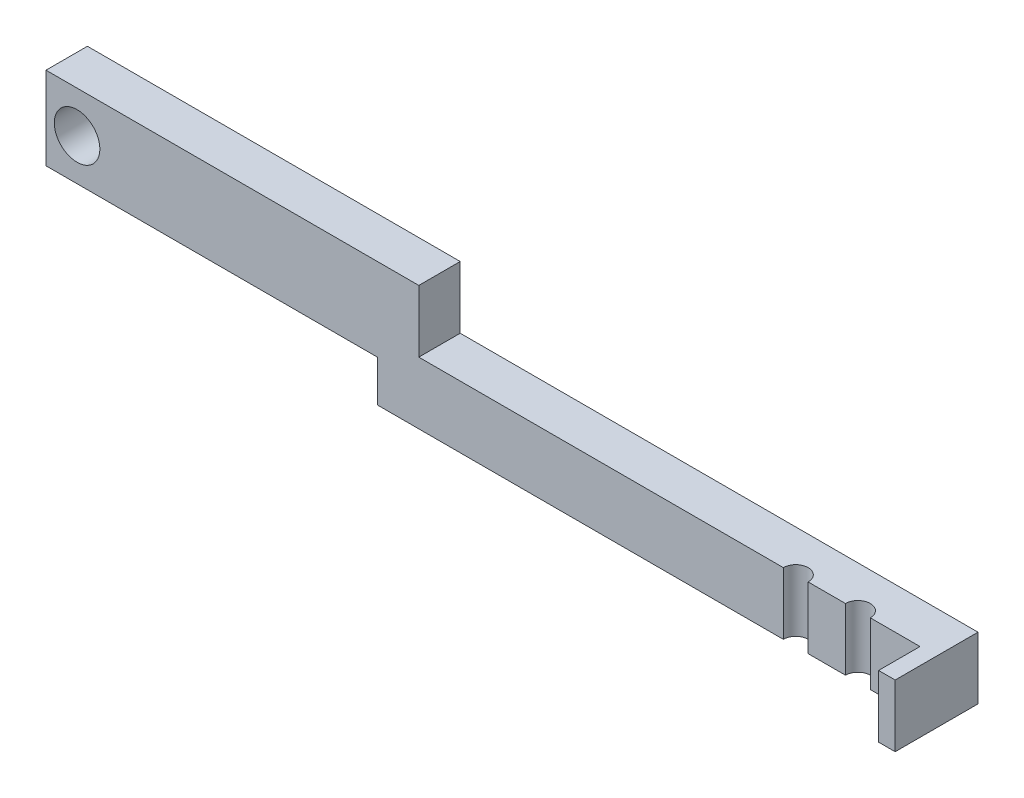
ISO-10303-21;
HEADER;
FILE_DESCRIPTION(('STEP AP214'),'2;1');
FILE_NAME('part.step','',(''),(''),'','','');
FILE_SCHEMA(('AUTOMOTIVE_DESIGN { 1 0 10303 214 1 1 1 1 }'));
ENDSEC;
DATA;
#1=APPLICATION_CONTEXT('core data for automotive mechanical design processes');
#2=APPLICATION_PROTOCOL_DEFINITION('international standard','automotive_design',2000,#1);
#3=PRODUCT_CONTEXT('',#1,'mechanical');
#4=PRODUCT('Part','Part','',(#3));
#5=PRODUCT_RELATED_PRODUCT_CATEGORY('part','',(#4));
#6=PRODUCT_DEFINITION_FORMATION('','',#4);
#7=PRODUCT_DEFINITION_CONTEXT('part definition',#1,'design');
#8=PRODUCT_DEFINITION('design','',#6,#7);
#9=PRODUCT_DEFINITION_SHAPE('','',#8);
#10=(LENGTH_UNIT() NAMED_UNIT(*) SI_UNIT(.MILLI.,.METRE.));
#11=(NAMED_UNIT(*) PLANE_ANGLE_UNIT() SI_UNIT($,.RADIAN.));
#12=(NAMED_UNIT(*) SI_UNIT($,.STERADIAN.) SOLID_ANGLE_UNIT());
#13=UNCERTAINTY_MEASURE_WITH_UNIT(LENGTH_MEASURE(1.E-05),#10,'distance_accuracy_value','');
#14=(GEOMETRIC_REPRESENTATION_CONTEXT(3) GLOBAL_UNCERTAINTY_ASSIGNED_CONTEXT((#13)) GLOBAL_UNIT_ASSIGNED_CONTEXT((#10,
#11,#12)) REPRESENTATION_CONTEXT('',''));
#15=CARTESIAN_POINT('',(0.,0.,0.));
#16=DIRECTION('',(0.,0.,1.));
#17=DIRECTION('',(1.,0.,0.));
#18=AXIS2_PLACEMENT_3D('',#15,#16,#17);
#19=CARTESIAN_POINT('',(0.,0.,2.));
#20=DIRECTION('',(0.,0.,-1.));
#21=DIRECTION('',(-1.,0.,0.));
#22=AXIS2_PLACEMENT_3D('',#19,#20,#21);
#23=PLANE('',#22);
#24=DIRECTION('',(1.,0.,0.));
#25=VECTOR('',#24,1.);
#26=CARTESIAN_POINT('',(16.,-2.,2.));
#27=LINE('',#26,#25);
#28=CARTESIAN_POINT('',(36.8,-2.,2.));
#29=VERTEX_POINT('',#28);
#30=CARTESIAN_POINT('',(38.6,-2.,2.));
#31=VERTEX_POINT('',#30);
#32=EDGE_CURVE('E148',#29,#31,#27,.T.);
#33=ORIENTED_EDGE('',*,*,#32,.T.);
#34=DIRECTION('',(0.,1.,0.));
#35=VECTOR('',#34,1.);
#36=CARTESIAN_POINT('',(38.6,-2.,2.));
#37=LINE('',#36,#35);
#38=CARTESIAN_POINT('',(38.6,1.,2.));
#39=VERTEX_POINT('',#38);
#40=EDGE_CURVE('E183',#31,#39,#37,.T.);
#41=ORIENTED_EDGE('',*,*,#40,.T.);
#42=DIRECTION('',(-1.,0.,0.));
#43=VECTOR('',#42,1.);
#44=CARTESIAN_POINT('',(43.,1.,2.));
#45=LINE('',#44,#43);
#46=CARTESIAN_POINT('',(36.8,1.,2.));
#47=VERTEX_POINT('',#46);
#48=EDGE_CURVE('E159',#39,#47,#45,.T.);
#49=ORIENTED_EDGE('',*,*,#48,.T.);
#50=DIRECTION('',(0.,1.,0.));
#51=VECTOR('',#50,1.);
#52=CARTESIAN_POINT('',(36.8,-2.,2.));
#53=LINE('',#52,#51);
#54=EDGE_CURVE('E48',#47,#29,#53,.F.);
#55=ORIENTED_EDGE('',*,*,#54,.T.);
#56=EDGE_LOOP('',(#33,#41,#49,#55));
#57=FACE_BOUND('',#56,.T.);
#58=ADVANCED_FACE('F33',(#57),#23,.F.);
#59=CARTESIAN_POINT('',(1.5,2.,2.));
#60=DIRECTION('',(0.,0.,-1.));
#61=DIRECTION('',(-1.,0.,0.));
#62=AXIS2_PLACEMENT_3D('',#59,#60,#61);
#63=CIRCLE('',#62,1.1);
#64=CARTESIAN_POINT('',(0.4,2.,2.));
#65=VERTEX_POINT('',#64);
#66=EDGE_CURVE('E150',#65,#65,#63,.T.);
#67=ORIENTED_EDGE('',*,*,#66,.T.);
#68=EDGE_LOOP('',(#67));
#69=FACE_BOUND('',#68,.T.);
#70=CARTESIAN_POINT('',(16.,-2.,2.));
#71=VERTEX_POINT('',#70);
#72=CARTESIAN_POINT('',(35.6,-2.,2.));
#73=VERTEX_POINT('',#72);
#74=EDGE_CURVE('E145',#71,#73,#27,.T.);
#75=ORIENTED_EDGE('',*,*,#74,.T.);
#76=DIRECTION('',(0.,1.,0.));
#77=VECTOR('',#76,1.);
#78=CARTESIAN_POINT('',(35.6,-2.,2.));
#79=LINE('',#78,#77);
#80=CARTESIAN_POINT('',(35.6,1.,2.));
#81=VERTEX_POINT('',#80);
#82=EDGE_CURVE('E131',#73,#81,#79,.T.);
#83=ORIENTED_EDGE('',*,*,#82,.T.);
#84=CARTESIAN_POINT('',(18.,1.,2.));
#85=VERTEX_POINT('',#84);
#86=EDGE_CURVE('E156',#81,#85,#45,.T.);
#87=ORIENTED_EDGE('',*,*,#86,.T.);
#88=DIRECTION('',(0.,1.,0.));
#89=VECTOR('',#88,1.);
#90=CARTESIAN_POINT('',(18.,1.,2.));
#91=LINE('',#90,#89);
#92=CARTESIAN_POINT('',(18.,4.,2.));
#93=VERTEX_POINT('',#92);
#94=EDGE_CURVE('E267',#85,#93,#91,.T.);
#95=ORIENTED_EDGE('',*,*,#94,.T.);
#96=DIRECTION('',(-1.,0.,0.));
#97=VECTOR('',#96,1.);
#98=CARTESIAN_POINT('',(18.,4.,2.));
#99=LINE('',#98,#97);
#100=CARTESIAN_POINT('',(0.,4.,2.));
#101=VERTEX_POINT('',#100);
#102=EDGE_CURVE('E226',#93,#101,#99,.T.);
#103=ORIENTED_EDGE('',*,*,#102,.T.);
#104=DIRECTION('',(0.,-1.,0.));
#105=VECTOR('',#104,1.);
#106=CARTESIAN_POINT('',(0.,0.,2.));
#107=LINE('',#106,#105);
#108=CARTESIAN_POINT('',(0.,0.,2.));
#109=VERTEX_POINT('',#108);
#110=EDGE_CURVE('E166',#101,#109,#107,.T.);
#111=ORIENTED_EDGE('',*,*,#110,.T.);
#112=DIRECTION('',(1.,0.,0.));
#113=VECTOR('',#112,1.);
#114=CARTESIAN_POINT('',(0.,0.,2.));
#115=LINE('',#114,#113);
#116=CARTESIAN_POINT('',(16.,0.,2.));
#117=VERTEX_POINT('',#116);
#118=EDGE_CURVE('E165',#109,#117,#115,.T.);
#119=ORIENTED_EDGE('',*,*,#118,.T.);
#120=DIRECTION('',(0.,-1.,0.));
#121=VECTOR('',#120,1.);
#122=CARTESIAN_POINT('',(16.,0.,2.));
#123=LINE('',#122,#121);
#124=EDGE_CURVE('E154',#117,#71,#123,.T.);
#125=ORIENTED_EDGE('',*,*,#124,.T.);
#126=EDGE_LOOP('',(#75,#83,#87,#95,#103,#111,#119,#125));
#127=FACE_BOUND('',#126,.T.);
#128=ADVANCED_FACE('F152',(#69,#127),#23,.F.);
#129=CARTESIAN_POINT('',(42.2,1.,2.));
#130=VERTEX_POINT('',#129);
#131=CARTESIAN_POINT('',(39.8,1.,2.));
#132=VERTEX_POINT('',#131);
#133=EDGE_CURVE('E161',#130,#132,#45,.T.);
#134=ORIENTED_EDGE('',*,*,#133,.T.);
#135=DIRECTION('',(0.,1.,0.));
#136=VECTOR('',#135,1.);
#137=CARTESIAN_POINT('',(39.8,-2.,2.));
#138=LINE('',#137,#136);
#139=CARTESIAN_POINT('',(39.8,-2.,2.));
#140=VERTEX_POINT('',#139);
#141=EDGE_CURVE('E56',#132,#140,#138,.F.);
#142=ORIENTED_EDGE('',*,*,#141,.T.);
#143=CARTESIAN_POINT('',(42.2,-2.,2.));
#144=VERTEX_POINT('',#143);
#145=EDGE_CURVE('E158',#140,#144,#27,.T.);
#146=ORIENTED_EDGE('',*,*,#145,.T.);
#147=DIRECTION('',(0.,-1.,0.));
#148=VECTOR('',#147,1.);
#149=CARTESIAN_POINT('',(42.2,-2.,2.));
#150=LINE('',#149,#148);
#151=EDGE_CURVE('E180',#130,#144,#150,.T.);
#152=ORIENTED_EDGE('',*,*,#151,.F.);
#153=EDGE_LOOP('',(#134,#142,#146,#152));
#154=FACE_BOUND('',#153,.T.);
#155=ADVANCED_FACE('F298',(#154),#23,.F.);
#156=CARTESIAN_POINT('',(0.,0.,2.));
#157=DIRECTION('',(1.,0.,0.));
#158=DIRECTION('',(0.,0.,-1.));
#159=AXIS2_PLACEMENT_3D('',#156,#157,#158);
#160=PLANE('',#159);
#161=DIRECTION('',(0.,-1.,0.));
#162=VECTOR('',#161,1.);
#163=CARTESIAN_POINT('',(0.,0.,0.));
#164=LINE('',#163,#162);
#165=CARTESIAN_POINT('',(0.,4.,0.));
#166=VERTEX_POINT('',#165);
#167=CARTESIAN_POINT('',(0.,0.,0.));
#168=VERTEX_POINT('',#167);
#169=EDGE_CURVE('E175',#166,#168,#164,.T.);
#170=ORIENTED_EDGE('',*,*,#169,.T.);
#171=DIRECTION('',(0.,0.,-1.));
#172=VECTOR('',#171,1.);
#173=CARTESIAN_POINT('',(0.,0.,2.));
#174=LINE('',#173,#172);
#175=EDGE_CURVE('E259',#109,#168,#174,.T.);
#176=ORIENTED_EDGE('',*,*,#175,.F.);
#177=ORIENTED_EDGE('',*,*,#110,.F.);
#178=DIRECTION('',(0.,0.,-1.));
#179=VECTOR('',#178,1.);
#180=CARTESIAN_POINT('',(0.,4.,2.));
#181=LINE('',#180,#179);
#182=EDGE_CURVE('E240',#101,#166,#181,.T.);
#183=ORIENTED_EDGE('',*,*,#182,.T.);
#184=EDGE_LOOP('',(#170,#176,#177,#183));
#185=FACE_BOUND('',#184,.T.);
#186=ADVANCED_FACE('F35',(#185),#160,.F.);
#187=CARTESIAN_POINT('',(0.,0.,2.));
#188=DIRECTION('',(0.,1.,0.));
#189=DIRECTION('',(0.,0.,1.));
#190=AXIS2_PLACEMENT_3D('',#187,#188,#189);
#191=PLANE('',#190);
#192=DIRECTION('',(1.,0.,0.));
#193=VECTOR('',#192,1.);
#194=CARTESIAN_POINT('',(0.,0.,0.));
#195=LINE('',#194,#193);
#196=CARTESIAN_POINT('',(16.,0.,0.));
#197=VERTEX_POINT('',#196);
#198=EDGE_CURVE('E217',#168,#197,#195,.T.);
#199=ORIENTED_EDGE('',*,*,#198,.T.);
#200=DIRECTION('',(0.,0.,-1.));
#201=VECTOR('',#200,1.);
#202=CARTESIAN_POINT('',(16.,0.,2.));
#203=LINE('',#202,#201);
#204=EDGE_CURVE('E256',#117,#197,#203,.T.);
#205=ORIENTED_EDGE('',*,*,#204,.F.);
#206=ORIENTED_EDGE('',*,*,#118,.F.);
#207=ORIENTED_EDGE('',*,*,#175,.T.);
#208=EDGE_LOOP('',(#199,#205,#206,#207));
#209=FACE_BOUND('',#208,.T.);
#210=ADVANCED_FACE('F275',(#209),#191,.F.);
#211=CARTESIAN_POINT('',(16.,0.,2.));
#212=DIRECTION('',(1.,0.,0.));
#213=DIRECTION('',(0.,0.,-1.));
#214=AXIS2_PLACEMENT_3D('',#211,#212,#213);
#215=PLANE('',#214);
#216=DIRECTION('',(0.,-1.,0.));
#217=VECTOR('',#216,1.);
#218=CARTESIAN_POINT('',(16.,0.,0.));
#219=LINE('',#218,#217);
#220=CARTESIAN_POINT('',(16.,-2.,0.));
#221=VERTEX_POINT('',#220);
#222=EDGE_CURVE('E223',#197,#221,#219,.T.);
#223=ORIENTED_EDGE('',*,*,#222,.T.);
#224=DIRECTION('',(0.,0.,-1.));
#225=VECTOR('',#224,1.);
#226=CARTESIAN_POINT('',(16.,-2.,2.));
#227=LINE('',#226,#225);
#228=EDGE_CURVE('E254',#71,#221,#227,.T.);
#229=ORIENTED_EDGE('',*,*,#228,.F.);
#230=ORIENTED_EDGE('',*,*,#124,.F.);
#231=ORIENTED_EDGE('',*,*,#204,.T.);
#232=EDGE_LOOP('',(#223,#229,#230,#231));
#233=FACE_BOUND('',#232,.T.);
#234=ADVANCED_FACE('F278',(#233),#215,.F.);
#235=CARTESIAN_POINT('',(19.,-2.,2.));
#236=DIRECTION('',(0.,1.,0.));
#237=DIRECTION('',(0.,0.,1.));
#238=AXIS2_PLACEMENT_3D('',#235,#236,#237);
#239=PLANE('',#238);
#240=ORIENTED_EDGE('',*,*,#145,.F.);
#241=CARTESIAN_POINT('',(39.2,-2.,2.));
#242=DIRECTION('',(0.,1.,0.));
#243=DIRECTION('',(-1.,0.,0.));
#244=AXIS2_PLACEMENT_3D('',#241,#242,#243);
#245=CIRCLE('',#244,0.600000000000001);
#246=EDGE_CURVE('E149',#140,#31,#245,.T.);
#247=ORIENTED_EDGE('',*,*,#246,.T.);
#248=ORIENTED_EDGE('',*,*,#32,.F.);
#249=CARTESIAN_POINT('',(36.2,-2.,2.));
#250=DIRECTION('',(0.,1.,0.));
#251=DIRECTION('',(-1.,0.,0.));
#252=AXIS2_PLACEMENT_3D('',#249,#250,#251);
#253=CIRCLE('',#252,0.600000000000001);
#254=EDGE_CURVE('E134',#29,#73,#253,.T.);
#255=ORIENTED_EDGE('',*,*,#254,.T.);
#256=ORIENTED_EDGE('',*,*,#74,.F.);
#257=ORIENTED_EDGE('',*,*,#228,.T.);
#258=DIRECTION('',(1.,0.,0.));
#259=VECTOR('',#258,1.);
#260=CARTESIAN_POINT('',(19.,-2.,0.));
#261=LINE('',#260,#259);
#262=CARTESIAN_POINT('',(43.,-2.,0.));
#263=VERTEX_POINT('',#262);
#264=EDGE_CURVE('E231',#221,#263,#261,.T.);
#265=ORIENTED_EDGE('',*,*,#264,.T.);
#266=DIRECTION('',(0.,0.,-1.));
#267=VECTOR('',#266,1.);
#268=CARTESIAN_POINT('',(43.,-2.,2.));
#269=LINE('',#268,#267);
#270=CARTESIAN_POINT('',(43.,-2.,4.));
#271=VERTEX_POINT('',#270);
#272=EDGE_CURVE('E251',#271,#263,#269,.T.);
#273=ORIENTED_EDGE('',*,*,#272,.F.);
#274=DIRECTION('',(1.,0.,0.));
#275=VECTOR('',#274,1.);
#276=CARTESIAN_POINT('',(43.,-2.,4.));
#277=LINE('',#276,#275);
#278=CARTESIAN_POINT('',(42.2,-2.,4.));
#279=VERTEX_POINT('',#278);
#280=EDGE_CURVE('E179',#279,#271,#277,.T.);
#281=ORIENTED_EDGE('',*,*,#280,.F.);
#282=DIRECTION('',(0.,0.,-1.));
#283=VECTOR('',#282,1.);
#284=CARTESIAN_POINT('',(42.2,-2.,4.));
#285=LINE('',#284,#283);
#286=EDGE_CURVE('E176',#279,#144,#285,.T.);
#287=ORIENTED_EDGE('',*,*,#286,.T.);
#288=EDGE_LOOP('',(#240,#247,#248,#255,#256,#257,#265,#273,#281,#287));
#289=FACE_BOUND('',#288,.T.);
#290=ADVANCED_FACE('F143',(#289),#239,.F.);
#291=CARTESIAN_POINT('',(43.,-2.,2.));
#292=DIRECTION('',(-1.,0.,0.));
#293=DIRECTION('',(0.,0.,1.));
#294=AXIS2_PLACEMENT_3D('',#291,#292,#293);
#295=PLANE('',#294);
#296=DIRECTION('',(0.,1.,0.));
#297=VECTOR('',#296,1.);
#298=CARTESIAN_POINT('',(43.,-2.,0.));
#299=LINE('',#298,#297);
#300=CARTESIAN_POINT('',(43.,1.,0.));
#301=VERTEX_POINT('',#300);
#302=EDGE_CURVE('E233',#263,#301,#299,.T.);
#303=ORIENTED_EDGE('',*,*,#302,.T.);
#304=DIRECTION('',(0.,0.,-1.));
#305=VECTOR('',#304,1.);
#306=CARTESIAN_POINT('',(43.,1.,2.));
#307=LINE('',#306,#305);
#308=CARTESIAN_POINT('',(43.,1.,4.));
#309=VERTEX_POINT('',#308);
#310=EDGE_CURVE('E248',#309,#301,#307,.T.);
#311=ORIENTED_EDGE('',*,*,#310,.F.);
#312=DIRECTION('',(0.,1.,0.));
#313=VECTOR('',#312,1.);
#314=CARTESIAN_POINT('',(43.,-2.,4.));
#315=LINE('',#314,#313);
#316=EDGE_CURVE('E182',#271,#309,#315,.T.);
#317=ORIENTED_EDGE('',*,*,#316,.F.);
#318=ORIENTED_EDGE('',*,*,#272,.T.);
#319=EDGE_LOOP('',(#303,#311,#317,#318));
#320=FACE_BOUND('',#319,.T.);
#321=ADVANCED_FACE('F283',(#320),#295,.F.);
#322=CARTESIAN_POINT('',(43.,1.,2.));
#323=DIRECTION('',(0.,-1.,0.));
#324=DIRECTION('',(1.,0.,0.));
#325=AXIS2_PLACEMENT_3D('',#322,#323,#324);
#326=PLANE('',#325);
#327=ORIENTED_EDGE('',*,*,#48,.F.);
#328=CARTESIAN_POINT('',(39.2,1.,2.));
#329=DIRECTION('',(0.,-1.,0.));
#330=DIRECTION('',(1.,0.,0.));
#331=AXIS2_PLACEMENT_3D('',#328,#329,#330);
#332=CIRCLE('',#331,0.600000000000001);
#333=EDGE_CURVE('E11',#39,#132,#332,.T.);
#334=ORIENTED_EDGE('',*,*,#333,.T.);
#335=ORIENTED_EDGE('',*,*,#133,.F.);
#336=DIRECTION('',(0.,0.,-1.));
#337=VECTOR('',#336,1.);
#338=CARTESIAN_POINT('',(42.2,1.,4.));
#339=LINE('',#338,#337);
#340=CARTESIAN_POINT('',(42.2,1.,4.));
#341=VERTEX_POINT('',#340);
#342=EDGE_CURVE('E172',#341,#130,#339,.T.);
#343=ORIENTED_EDGE('',*,*,#342,.F.);
#344=DIRECTION('',(-1.,0.,0.));
#345=VECTOR('',#344,1.);
#346=CARTESIAN_POINT('',(43.,1.,4.));
#347=LINE('',#346,#345);
#348=EDGE_CURVE('E188',#309,#341,#347,.T.);
#349=ORIENTED_EDGE('',*,*,#348,.F.);
#350=ORIENTED_EDGE('',*,*,#310,.T.);
#351=DIRECTION('',(-1.,0.,0.));
#352=VECTOR('',#351,1.);
#353=CARTESIAN_POINT('',(43.,1.,0.));
#354=LINE('',#353,#352);
#355=CARTESIAN_POINT('',(18.,1.,0.));
#356=VERTEX_POINT('',#355);
#357=EDGE_CURVE('E235',#301,#356,#354,.T.);
#358=ORIENTED_EDGE('',*,*,#357,.T.);
#359=DIRECTION('',(0.,0.,-1.));
#360=VECTOR('',#359,1.);
#361=CARTESIAN_POINT('',(18.,1.,2.));
#362=LINE('',#361,#360);
#363=EDGE_CURVE('E245',#85,#356,#362,.T.);
#364=ORIENTED_EDGE('',*,*,#363,.F.);
#365=ORIENTED_EDGE('',*,*,#86,.F.);
#366=CARTESIAN_POINT('',(36.2,1.,2.));
#367=DIRECTION('',(0.,-1.,0.));
#368=DIRECTION('',(1.,0.,0.));
#369=AXIS2_PLACEMENT_3D('',#366,#367,#368);
#370=CIRCLE('',#369,0.600000000000001);
#371=EDGE_CURVE('E41',#81,#47,#370,.T.);
#372=ORIENTED_EDGE('',*,*,#371,.T.);
#373=EDGE_LOOP('',(#327,#334,#335,#343,#349,#350,#358,#364,#365,#372));
#374=FACE_BOUND('',#373,.T.);
#375=ADVANCED_FACE('F263',(#374),#326,.F.);
#376=CARTESIAN_POINT('',(18.,1.,2.));
#377=DIRECTION('',(-1.,0.,0.));
#378=DIRECTION('',(0.,0.,1.));
#379=AXIS2_PLACEMENT_3D('',#376,#377,#378);
#380=PLANE('',#379);
#381=DIRECTION('',(0.,1.,0.));
#382=VECTOR('',#381,1.);
#383=CARTESIAN_POINT('',(18.,1.,0.));
#384=LINE('',#383,#382);
#385=CARTESIAN_POINT('',(18.,4.,0.));
#386=VERTEX_POINT('',#385);
#387=EDGE_CURVE('E237',#356,#386,#384,.T.);
#388=ORIENTED_EDGE('',*,*,#387,.T.);
#389=DIRECTION('',(0.,0.,-1.));
#390=VECTOR('',#389,1.);
#391=CARTESIAN_POINT('',(18.,4.,2.));
#392=LINE('',#391,#390);
#393=EDGE_CURVE('E242',#93,#386,#392,.T.);
#394=ORIENTED_EDGE('',*,*,#393,.F.);
#395=ORIENTED_EDGE('',*,*,#94,.F.);
#396=ORIENTED_EDGE('',*,*,#363,.T.);
#397=EDGE_LOOP('',(#388,#394,#395,#396));
#398=FACE_BOUND('',#397,.T.);
#399=ADVANCED_FACE('F287',(#398),#380,.F.);
#400=CARTESIAN_POINT('',(0.,4.,2.));
#401=DIRECTION('',(0.,-1.,0.));
#402=DIRECTION('',(0.,0.,-1.));
#403=AXIS2_PLACEMENT_3D('',#400,#401,#402);
#404=PLANE('',#403);
#405=DIRECTION('',(-1.,0.,0.));
#406=VECTOR('',#405,1.);
#407=CARTESIAN_POINT('',(0.,4.,0.));
#408=LINE('',#407,#406);
#409=EDGE_CURVE('E171',#386,#166,#408,.T.);
#410=ORIENTED_EDGE('',*,*,#409,.T.);
#411=ORIENTED_EDGE('',*,*,#182,.F.);
#412=ORIENTED_EDGE('',*,*,#102,.F.);
#413=ORIENTED_EDGE('',*,*,#393,.T.);
#414=EDGE_LOOP('',(#410,#411,#412,#413));
#415=FACE_BOUND('',#414,.T.);
#416=ADVANCED_FACE('F210',(#415),#404,.F.);
#417=CARTESIAN_POINT('',(0.,0.,0.));
#418=DIRECTION('',(0.,0.,-1.));
#419=DIRECTION('',(-1.,0.,0.));
#420=AXIS2_PLACEMENT_3D('',#417,#418,#419);
#421=PLANE('',#420);
#422=CARTESIAN_POINT('',(1.5,2.,0.));
#423=DIRECTION('',(0.,0.,-1.));
#424=DIRECTION('',(-1.,0.,0.));
#425=AXIS2_PLACEMENT_3D('',#422,#423,#424);
#426=CIRCLE('',#425,1.1);
#427=CARTESIAN_POINT('',(0.4,2.,0.));
#428=VERTEX_POINT('',#427);
#429=EDGE_CURVE('E199',#428,#428,#426,.T.);
#430=ORIENTED_EDGE('',*,*,#429,.F.);
#431=EDGE_LOOP('',(#430));
#432=FACE_BOUND('',#431,.T.);
#433=ORIENTED_EDGE('',*,*,#169,.F.);
#434=ORIENTED_EDGE('',*,*,#409,.F.);
#435=ORIENTED_EDGE('',*,*,#387,.F.);
#436=ORIENTED_EDGE('',*,*,#357,.F.);
#437=ORIENTED_EDGE('',*,*,#302,.F.);
#438=ORIENTED_EDGE('',*,*,#264,.F.);
#439=ORIENTED_EDGE('',*,*,#222,.F.);
#440=ORIENTED_EDGE('',*,*,#198,.F.);
#441=EDGE_LOOP('',(#433,#434,#435,#436,#437,#438,#439,#440));
#442=FACE_BOUND('',#441,.T.);
#443=ADVANCED_FACE('F206',(#432,#442),#421,.T.);
#444=CARTESIAN_POINT('',(42.2,-2.,4.));
#445=DIRECTION('',(1.,0.,0.));
#446=DIRECTION('',(0.,0.,-1.));
#447=AXIS2_PLACEMENT_3D('',#444,#445,#446);
#448=PLANE('',#447);
#449=ORIENTED_EDGE('',*,*,#151,.T.);
#450=ORIENTED_EDGE('',*,*,#286,.F.);
#451=DIRECTION('',(0.,-1.,0.));
#452=VECTOR('',#451,1.);
#453=CARTESIAN_POINT('',(42.2,-2.,4.));
#454=LINE('',#453,#452);
#455=EDGE_CURVE('E186',#341,#279,#454,.T.);
#456=ORIENTED_EDGE('',*,*,#455,.F.);
#457=ORIENTED_EDGE('',*,*,#342,.T.);
#458=EDGE_LOOP('',(#449,#450,#456,#457));
#459=FACE_BOUND('',#458,.T.);
#460=ADVANCED_FACE('F209',(#459),#448,.F.);
#461=CARTESIAN_POINT('',(0.,0.,4.));
#462=DIRECTION('',(0.,0.,1.));
#463=DIRECTION('',(1.,0.,0.));
#464=AXIS2_PLACEMENT_3D('',#461,#462,#463);
#465=PLANE('',#464);
#466=ORIENTED_EDGE('',*,*,#316,.T.);
#467=ORIENTED_EDGE('',*,*,#348,.T.);
#468=ORIENTED_EDGE('',*,*,#455,.T.);
#469=ORIENTED_EDGE('',*,*,#280,.T.);
#470=EDGE_LOOP('',(#466,#467,#468,#469));
#471=FACE_BOUND('',#470,.T.);
#472=ADVANCED_FACE('F314',(#471),#465,.T.);
#473=CARTESIAN_POINT('',(36.2,-2.,2.));
#474=DIRECTION('',(0.,1.,0.));
#475=DIRECTION('',(-1.,0.,0.));
#476=AXIS2_PLACEMENT_3D('',#473,#474,#475);
#477=CYLINDRICAL_SURFACE('',#476,0.600000000000001);
#478=ORIENTED_EDGE('',*,*,#254,.F.);
#479=ORIENTED_EDGE('',*,*,#54,.F.);
#480=ORIENTED_EDGE('',*,*,#371,.F.);
#481=ORIENTED_EDGE('',*,*,#82,.F.);
#482=EDGE_LOOP('',(#478,#479,#480,#481));
#483=FACE_BOUND('',#482,.T.);
#484=ADVANCED_FACE('F133',(#483),#477,.F.);
#485=CARTESIAN_POINT('',(39.2,-2.,2.));
#486=DIRECTION('',(0.,1.,0.));
#487=DIRECTION('',(-1.,0.,0.));
#488=AXIS2_PLACEMENT_3D('',#485,#486,#487);
#489=CYLINDRICAL_SURFACE('',#488,0.600000000000001);
#490=ORIENTED_EDGE('',*,*,#246,.F.);
#491=ORIENTED_EDGE('',*,*,#141,.F.);
#492=ORIENTED_EDGE('',*,*,#333,.F.);
#493=ORIENTED_EDGE('',*,*,#40,.F.);
#494=EDGE_LOOP('',(#490,#491,#492,#493));
#495=FACE_BOUND('',#494,.T.);
#496=ADVANCED_FACE('F315',(#495),#489,.F.);
#497=CARTESIAN_POINT('',(1.5,2.,4.));
#498=DIRECTION('',(0.,0.,-1.));
#499=DIRECTION('',(-1.,0.,0.));
#500=AXIS2_PLACEMENT_3D('',#497,#498,#499);
#501=CYLINDRICAL_SURFACE('',#500,1.1);
#502=ORIENTED_EDGE('',*,*,#429,.T.);
#503=EDGE_LOOP('',(#502));
#504=FACE_BOUND('',#503,.T.);
#505=ORIENTED_EDGE('',*,*,#66,.F.);
#506=EDGE_LOOP('',(#505));
#507=FACE_BOUND('',#506,.T.);
#508=ADVANCED_FACE('F203',(#504,#507),#501,.F.);
#509=CLOSED_SHELL('',(#58,#128,#155,#186,#210,#234,#290,#321,#375,#399,#416,#443,#460,#472,#484,
#496,#508));
#510=MANIFOLD_SOLID_BREP('B2',#509);
#511=ADVANCED_BREP_SHAPE_REPRESENTATION('',(#18,#510),#14);
#512=SHAPE_DEFINITION_REPRESENTATION(#9,#511);
ENDSEC;
END-ISO-10303-21;
